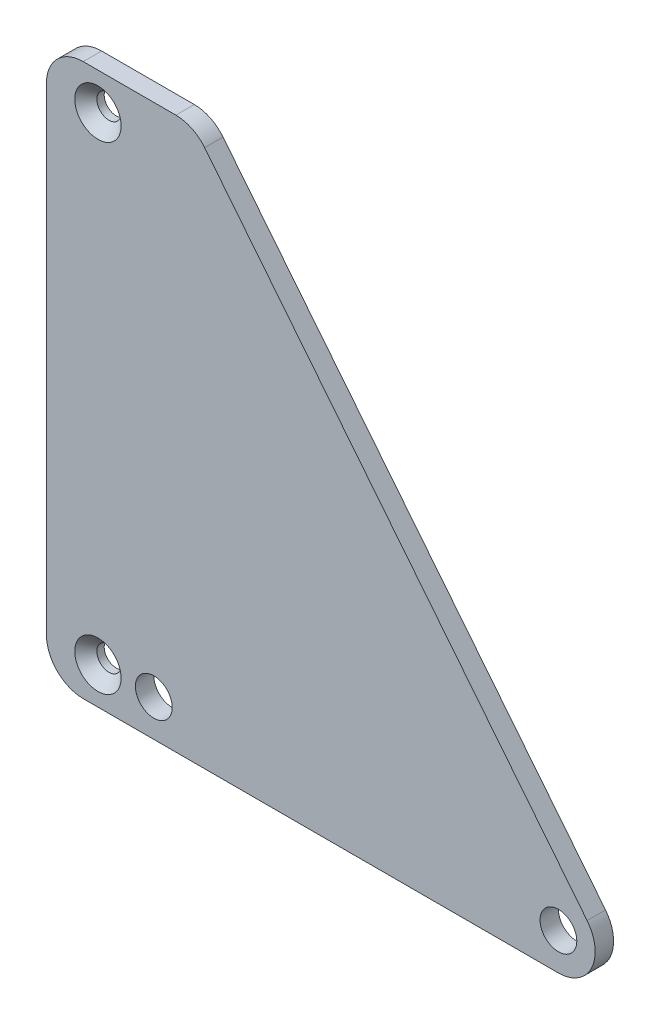
ISO-10303-21;
HEADER;
FILE_DESCRIPTION(('STEP AP214'),'2;1');
FILE_NAME('part.step','',(''),(''),'','','');
FILE_SCHEMA(('AUTOMOTIVE_DESIGN { 1 0 10303 214 1 1 1 1 }'));
ENDSEC;
DATA;
#1=APPLICATION_CONTEXT('core data for automotive mechanical design processes');
#2=APPLICATION_PROTOCOL_DEFINITION('international standard','automotive_design',2000,#1);
#3=PRODUCT_CONTEXT('',#1,'mechanical');
#4=PRODUCT('Part','Part','',(#3));
#5=PRODUCT_RELATED_PRODUCT_CATEGORY('part','',(#4));
#6=PRODUCT_DEFINITION_FORMATION('','',#4);
#7=PRODUCT_DEFINITION_CONTEXT('part definition',#1,'design');
#8=PRODUCT_DEFINITION('design','',#6,#7);
#9=PRODUCT_DEFINITION_SHAPE('','',#8);
#10=(LENGTH_UNIT() NAMED_UNIT(*) SI_UNIT(.MILLI.,.METRE.));
#11=(NAMED_UNIT(*) PLANE_ANGLE_UNIT() SI_UNIT($,.RADIAN.));
#12=(NAMED_UNIT(*) SI_UNIT($,.STERADIAN.) SOLID_ANGLE_UNIT());
#13=UNCERTAINTY_MEASURE_WITH_UNIT(LENGTH_MEASURE(1.E-05),#10,'distance_accuracy_value','');
#14=(GEOMETRIC_REPRESENTATION_CONTEXT(3) GLOBAL_UNCERTAINTY_ASSIGNED_CONTEXT((#13)) GLOBAL_UNIT_ASSIGNED_CONTEXT((#10,
#11,#12)) REPRESENTATION_CONTEXT('',''));
#15=CARTESIAN_POINT('',(0.,0.,0.));
#16=DIRECTION('',(0.,0.,1.));
#17=DIRECTION('',(1.,0.,0.));
#18=AXIS2_PLACEMENT_3D('',#15,#16,#17);
#19=CARTESIAN_POINT('',(0.,150.,2.5));
#20=DIRECTION('',(1.,0.,0.));
#21=DIRECTION('',(0.,1.,0.));
#22=AXIS2_PLACEMENT_3D('',#19,#20,#21);
#23=PLANE('',#22);
#24=DIRECTION('',(0.,-1.,0.));
#25=VECTOR('',#24,1.);
#26=CARTESIAN_POINT('',(0.,150.,2.5));
#27=LINE('',#26,#25);
#28=CARTESIAN_POINT('',(0.,140.,2.5));
#29=VERTEX_POINT('',#28);
#30=CARTESIAN_POINT('',(0.,10.,2.5));
#31=VERTEX_POINT('',#30);
#32=EDGE_CURVE('E132',#29,#31,#27,.T.);
#33=ORIENTED_EDGE('',*,*,#32,.F.);
#34=DIRECTION('',(0.,0.,-1.));
#35=VECTOR('',#34,1.);
#36=CARTESIAN_POINT('',(0.,140.,2.5));
#37=LINE('',#36,#35);
#38=CARTESIAN_POINT('',(0.,140.,-2.5));
#39=VERTEX_POINT('',#38);
#40=EDGE_CURVE('E11',#29,#39,#37,.T.);
#41=ORIENTED_EDGE('',*,*,#40,.T.);
#42=DIRECTION('',(0.,-1.,0.));
#43=VECTOR('',#42,1.);
#44=CARTESIAN_POINT('',(0.,150.,-2.5));
#45=LINE('',#44,#43);
#46=CARTESIAN_POINT('',(0.,10.,-2.5));
#47=VERTEX_POINT('',#46);
#48=EDGE_CURVE('E134',#39,#47,#45,.T.);
#49=ORIENTED_EDGE('',*,*,#48,.T.);
#50=DIRECTION('',(0.,0.,-1.));
#51=VECTOR('',#50,1.);
#52=CARTESIAN_POINT('',(0.,10.,2.5));
#53=LINE('',#52,#51);
#54=EDGE_CURVE('E45',#47,#31,#53,.F.);
#55=ORIENTED_EDGE('',*,*,#54,.T.);
#56=EDGE_LOOP('',(#33,#41,#49,#55));
#57=FACE_BOUND('',#56,.T.);
#58=ADVANCED_FACE('F37',(#57),#23,.F.);
#59=CARTESIAN_POINT('',(0.,0.,2.5));
#60=DIRECTION('',(0.,1.,0.));
#61=DIRECTION('',(-1.,0.,0.));
#62=AXIS2_PLACEMENT_3D('',#59,#60,#61);
#63=PLANE('',#62);
#64=DIRECTION('',(1.,0.,0.));
#65=VECTOR('',#64,1.);
#66=CARTESIAN_POINT('',(0.,0.,-2.5));
#67=LINE('',#66,#65);
#68=CARTESIAN_POINT('',(10.,0.,-2.5));
#69=VERTEX_POINT('',#68);
#70=CARTESIAN_POINT('',(139.193751525134,0.,-2.5));
#71=VERTEX_POINT('',#70);
#72=EDGE_CURVE('E130',#69,#71,#67,.T.);
#73=ORIENTED_EDGE('',*,*,#72,.T.);
#74=DIRECTION('',(0.,0.,-1.));
#75=VECTOR('',#74,1.);
#76=CARTESIAN_POINT('',(139.193751525134,0.,2.5));
#77=LINE('',#76,#75);
#78=CARTESIAN_POINT('',(139.193751525134,0.,2.5));
#79=VERTEX_POINT('',#78);
#80=EDGE_CURVE('E109',#71,#79,#77,.F.);
#81=ORIENTED_EDGE('',*,*,#80,.T.);
#82=DIRECTION('',(1.,0.,0.));
#83=VECTOR('',#82,1.);
#84=CARTESIAN_POINT('',(0.,0.,2.5));
#85=LINE('',#84,#83);
#86=CARTESIAN_POINT('',(10.,0.,2.5));
#87=VERTEX_POINT('',#86);
#88=EDGE_CURVE('E170',#87,#79,#85,.T.);
#89=ORIENTED_EDGE('',*,*,#88,.F.);
#90=DIRECTION('',(0.,0.,-1.));
#91=VECTOR('',#90,1.);
#92=CARTESIAN_POINT('',(10.,0.,2.5));
#93=LINE('',#92,#91);
#94=EDGE_CURVE('E114',#87,#69,#93,.T.);
#95=ORIENTED_EDGE('',*,*,#94,.T.);
#96=EDGE_LOOP('',(#73,#81,#89,#95));
#97=FACE_BOUND('',#96,.T.);
#98=ADVANCED_FACE('F174',(#97),#63,.F.);
#99=CARTESIAN_POINT('',(40.,150.,2.5));
#100=DIRECTION('',(-0.78086880944303,-0.624695047554424,0.));
#101=DIRECTION('',(0.624695047554424,-0.78086880944303,0.));
#102=AXIS2_PLACEMENT_3D('',#99,#100,#101);
#103=PLANE('',#102);
#104=DIRECTION('',(-0.624695047554424,0.78086880944303,0.));
#105=VECTOR('',#104,1.);
#106=CARTESIAN_POINT('',(40.,150.,2.5));
#107=LINE('',#106,#105);
#108=CARTESIAN_POINT('',(147.002439619565,16.2469504755443,2.5));
#109=VERTEX_POINT('',#108);
#110=CARTESIAN_POINT('',(43.0024396195646,146.246950475544,2.5));
#111=VERTEX_POINT('',#110);
#112=EDGE_CURVE('E123',#109,#111,#107,.T.);
#113=ORIENTED_EDGE('',*,*,#112,.F.);
#114=DIRECTION('',(0.,0.,-1.));
#115=VECTOR('',#114,1.);
#116=CARTESIAN_POINT('',(147.002439619565,16.2469504755443,2.5));
#117=LINE('',#116,#115);
#118=CARTESIAN_POINT('',(147.002439619565,16.2469504755443,-2.5));
#119=VERTEX_POINT('',#118);
#120=EDGE_CURVE('E108',#109,#119,#117,.T.);
#121=ORIENTED_EDGE('',*,*,#120,.T.);
#122=DIRECTION('',(-0.624695047554424,0.78086880944303,0.));
#123=VECTOR('',#122,1.);
#124=CARTESIAN_POINT('',(40.,150.,-2.5));
#125=LINE('',#124,#123);
#126=CARTESIAN_POINT('',(43.0024396195646,146.246950475544,-2.5));
#127=VERTEX_POINT('',#126);
#128=EDGE_CURVE('E121',#119,#127,#125,.T.);
#129=ORIENTED_EDGE('',*,*,#128,.T.);
#130=DIRECTION('',(0.,0.,-1.));
#131=VECTOR('',#130,1.);
#132=CARTESIAN_POINT('',(43.0024396195646,146.246950475544,2.5));
#133=LINE('',#132,#131);
#134=EDGE_CURVE('E125',#127,#111,#133,.F.);
#135=ORIENTED_EDGE('',*,*,#134,.T.);
#136=EDGE_LOOP('',(#113,#121,#129,#135));
#137=FACE_BOUND('',#136,.T.);
#138=ADVANCED_FACE('F120',(#137),#103,.F.);
#139=CARTESIAN_POINT('',(0.,150.,2.5));
#140=DIRECTION('',(0.,-1.,0.));
#141=DIRECTION('',(0.,0.,-1.));
#142=AXIS2_PLACEMENT_3D('',#139,#140,#141);
#143=PLANE('',#142);
#144=DIRECTION('',(-1.,0.,0.));
#145=VECTOR('',#144,1.);
#146=CARTESIAN_POINT('',(0.,150.,2.5));
#147=LINE('',#146,#145);
#148=CARTESIAN_POINT('',(35.1937515251343,150.,2.5));
#149=VERTEX_POINT('',#148);
#150=CARTESIAN_POINT('',(9.99999999999999,150.,2.5));
#151=VERTEX_POINT('',#150);
#152=EDGE_CURVE('E138',#149,#151,#147,.T.);
#153=ORIENTED_EDGE('',*,*,#152,.F.);
#154=DIRECTION('',(0.,0.,-1.));
#155=VECTOR('',#154,1.);
#156=CARTESIAN_POINT('',(35.1937515251343,150.,2.5));
#157=LINE('',#156,#155);
#158=CARTESIAN_POINT('',(35.1937515251343,150.,-2.5));
#159=VERTEX_POINT('',#158);
#160=EDGE_CURVE('E155',#149,#159,#157,.T.);
#161=ORIENTED_EDGE('',*,*,#160,.T.);
#162=DIRECTION('',(-1.,0.,0.));
#163=VECTOR('',#162,1.);
#164=CARTESIAN_POINT('',(0.,150.,-2.5));
#165=LINE('',#164,#163);
#166=CARTESIAN_POINT('',(9.99999999999999,150.,-2.5));
#167=VERTEX_POINT('',#166);
#168=EDGE_CURVE('E129',#159,#167,#165,.T.);
#169=ORIENTED_EDGE('',*,*,#168,.T.);
#170=DIRECTION('',(0.,0.,-1.));
#171=VECTOR('',#170,1.);
#172=CARTESIAN_POINT('',(9.99999999999999,150.,2.5));
#173=LINE('',#172,#171);
#174=EDGE_CURVE('E52',#167,#151,#173,.F.);
#175=ORIENTED_EDGE('',*,*,#174,.T.);
#176=EDGE_LOOP('',(#153,#161,#169,#175));
#177=FACE_BOUND('',#176,.T.);
#178=ADVANCED_FACE('F221',(#177),#143,.F.);
#179=CARTESIAN_POINT('',(0.,0.,2.5));
#180=DIRECTION('',(0.,0.,1.));
#181=DIRECTION('',(1.,0.,0.));
#182=AXIS2_PLACEMENT_3D('',#179,#180,#181);
#183=PLANE('',#182);
#184=CARTESIAN_POINT('',(29.1937515251343,10.0000000000001,2.5));
#185=DIRECTION('',(0.,0.,1.));
#186=DIRECTION('',(1.,0.,0.));
#187=AXIS2_PLACEMENT_3D('',#184,#185,#186);
#188=CIRCLE('',#187,5.);
#189=CARTESIAN_POINT('',(34.1937515251343,10.0000000000001,2.5));
#190=VERTEX_POINT('',#189);
#191=EDGE_CURVE('E204',#190,#190,#188,.T.);
#192=ORIENTED_EDGE('',*,*,#191,.F.);
#193=EDGE_LOOP('',(#192));
#194=FACE_BOUND('',#193,.T.);
#195=CARTESIAN_POINT('',(139.193751525134,10.0000000000001,2.5));
#196=DIRECTION('',(0.,0.,1.));
#197=DIRECTION('',(1.,0.,0.));
#198=AXIS2_PLACEMENT_3D('',#195,#196,#197);
#199=CIRCLE('',#198,5.00000000000002);
#200=CARTESIAN_POINT('',(144.193751525134,10.0000000000001,2.5));
#201=VERTEX_POINT('',#200);
#202=EDGE_CURVE('E198',#201,#201,#199,.T.);
#203=ORIENTED_EDGE('',*,*,#202,.F.);
#204=EDGE_LOOP('',(#203));
#205=FACE_BOUND('',#204,.T.);
#206=CARTESIAN_POINT('',(14.,140.,2.5));
#207=DIRECTION('',(0.,0.,1.));
#208=DIRECTION('',(1.,0.,0.));
#209=AXIS2_PLACEMENT_3D('',#206,#207,#208);
#210=CIRCLE('',#209,6.3);
#211=CARTESIAN_POINT('',(20.3,140.,2.5));
#212=VERTEX_POINT('',#211);
#213=EDGE_CURVE('E194',#212,#212,#210,.T.);
#214=ORIENTED_EDGE('',*,*,#213,.F.);
#215=EDGE_LOOP('',(#214));
#216=FACE_BOUND('',#215,.T.);
#217=CARTESIAN_POINT('',(14.,10.,2.5));
#218=DIRECTION('',(0.,0.,1.));
#219=DIRECTION('',(1.,0.,0.));
#220=AXIS2_PLACEMENT_3D('',#217,#218,#219);
#221=CIRCLE('',#220,6.3);
#222=CARTESIAN_POINT('',(20.3,10.,2.5));
#223=VERTEX_POINT('',#222);
#224=EDGE_CURVE('E185',#223,#223,#221,.T.);
#225=ORIENTED_EDGE('',*,*,#224,.F.);
#226=EDGE_LOOP('',(#225));
#227=FACE_BOUND('',#226,.T.);
#228=ORIENTED_EDGE('',*,*,#88,.T.);
#229=CARTESIAN_POINT('',(139.193751525134,10.0000000000001,2.5));
#230=DIRECTION('',(0.,0.,1.));
#231=DIRECTION('',(1.,0.,0.));
#232=AXIS2_PLACEMENT_3D('',#229,#230,#231);
#233=CIRCLE('',#232,10.);
#234=EDGE_CURVE('E152',#79,#109,#233,.T.);
#235=ORIENTED_EDGE('',*,*,#234,.T.);
#236=ORIENTED_EDGE('',*,*,#112,.T.);
#237=CARTESIAN_POINT('',(35.1937515251343,140.,2.5));
#238=DIRECTION('',(0.,0.,1.));
#239=DIRECTION('',(1.,0.,0.));
#240=AXIS2_PLACEMENT_3D('',#237,#238,#239);
#241=CIRCLE('',#240,10.);
#242=EDGE_CURVE('E59',#111,#149,#241,.T.);
#243=ORIENTED_EDGE('',*,*,#242,.T.);
#244=ORIENTED_EDGE('',*,*,#152,.T.);
#245=CARTESIAN_POINT('',(9.99999999999999,140.,2.5));
#246=DIRECTION('',(0.,0.,1.));
#247=DIRECTION('',(1.,0.,0.));
#248=AXIS2_PLACEMENT_3D('',#245,#246,#247);
#249=CIRCLE('',#248,10.);
#250=EDGE_CURVE('E149',#151,#29,#249,.T.);
#251=ORIENTED_EDGE('',*,*,#250,.T.);
#252=ORIENTED_EDGE('',*,*,#32,.T.);
#253=CARTESIAN_POINT('',(10.,10.,2.5));
#254=DIRECTION('',(0.,0.,1.));
#255=DIRECTION('',(1.,0.,0.));
#256=AXIS2_PLACEMENT_3D('',#253,#254,#255);
#257=CIRCLE('',#256,10.);
#258=EDGE_CURVE('E147',#31,#87,#257,.T.);
#259=ORIENTED_EDGE('',*,*,#258,.T.);
#260=EDGE_LOOP('',(#228,#235,#236,#243,#244,#251,#252,#259));
#261=FACE_BOUND('',#260,.T.);
#262=ADVANCED_FACE('F167',(#194,#205,#216,#227,#261),#183,.T.);
#263=CARTESIAN_POINT('',(0.,0.,-2.5));
#264=DIRECTION('',(0.,0.,1.));
#265=DIRECTION('',(1.,0.,0.));
#266=AXIS2_PLACEMENT_3D('',#263,#264,#265);
#267=PLANE('',#266);
#268=CARTESIAN_POINT('',(29.1937515251343,10.0000000000001,-2.5));
#269=DIRECTION('',(0.,0.,1.));
#270=DIRECTION('',(1.,0.,0.));
#271=AXIS2_PLACEMENT_3D('',#268,#269,#270);
#272=CIRCLE('',#271,5.);
#273=CARTESIAN_POINT('',(34.1937515251343,10.0000000000001,-2.5));
#274=VERTEX_POINT('',#273);
#275=EDGE_CURVE('E197',#274,#274,#272,.T.);
#276=ORIENTED_EDGE('',*,*,#275,.T.);
#277=EDGE_LOOP('',(#276));
#278=FACE_BOUND('',#277,.T.);
#279=CARTESIAN_POINT('',(139.193751525134,10.0000000000001,-2.5));
#280=DIRECTION('',(0.,0.,1.));
#281=DIRECTION('',(1.,0.,0.));
#282=AXIS2_PLACEMENT_3D('',#279,#280,#281);
#283=CIRCLE('',#282,5.00000000000002);
#284=CARTESIAN_POINT('',(144.193751525134,10.0000000000001,-2.5));
#285=VERTEX_POINT('',#284);
#286=EDGE_CURVE('E201',#285,#285,#283,.T.);
#287=ORIENTED_EDGE('',*,*,#286,.T.);
#288=EDGE_LOOP('',(#287));
#289=FACE_BOUND('',#288,.T.);
#290=CARTESIAN_POINT('',(14.,140.,-2.5));
#291=DIRECTION('',(0.,0.,1.));
#292=DIRECTION('',(1.,0.,0.));
#293=AXIS2_PLACEMENT_3D('',#290,#291,#292);
#294=CIRCLE('',#293,3.3);
#295=CARTESIAN_POINT('',(17.3,140.,-2.5));
#296=VERTEX_POINT('',#295);
#297=EDGE_CURVE('E188',#296,#296,#294,.T.);
#298=ORIENTED_EDGE('',*,*,#297,.T.);
#299=EDGE_LOOP('',(#298));
#300=FACE_BOUND('',#299,.T.);
#301=CARTESIAN_POINT('',(14.,10.,-2.5));
#302=DIRECTION('',(0.,0.,1.));
#303=DIRECTION('',(1.,0.,0.));
#304=AXIS2_PLACEMENT_3D('',#301,#302,#303);
#305=CIRCLE('',#304,3.3);
#306=CARTESIAN_POINT('',(17.3,10.,-2.5));
#307=VERTEX_POINT('',#306);
#308=EDGE_CURVE('E175',#307,#307,#305,.T.);
#309=ORIENTED_EDGE('',*,*,#308,.T.);
#310=EDGE_LOOP('',(#309));
#311=FACE_BOUND('',#310,.T.);
#312=ORIENTED_EDGE('',*,*,#128,.F.);
#313=CARTESIAN_POINT('',(139.193751525134,10.0000000000001,-2.5));
#314=DIRECTION('',(0.,0.,1.));
#315=DIRECTION('',(1.,0.,0.));
#316=AXIS2_PLACEMENT_3D('',#313,#314,#315);
#317=CIRCLE('',#316,10.);
#318=EDGE_CURVE('E104',#119,#71,#317,.F.);
#319=ORIENTED_EDGE('',*,*,#318,.T.);
#320=ORIENTED_EDGE('',*,*,#72,.F.);
#321=CARTESIAN_POINT('',(10.,10.,-2.5));
#322=DIRECTION('',(0.,0.,1.));
#323=DIRECTION('',(1.,0.,0.));
#324=AXIS2_PLACEMENT_3D('',#321,#322,#323);
#325=CIRCLE('',#324,10.);
#326=EDGE_CURVE('E124',#69,#47,#325,.F.);
#327=ORIENTED_EDGE('',*,*,#326,.T.);
#328=ORIENTED_EDGE('',*,*,#48,.F.);
#329=CARTESIAN_POINT('',(9.99999999999999,140.,-2.5));
#330=DIRECTION('',(0.,0.,1.));
#331=DIRECTION('',(1.,0.,0.));
#332=AXIS2_PLACEMENT_3D('',#329,#330,#331);
#333=CIRCLE('',#332,10.);
#334=EDGE_CURVE('E141',#39,#167,#333,.F.);
#335=ORIENTED_EDGE('',*,*,#334,.T.);
#336=ORIENTED_EDGE('',*,*,#168,.F.);
#337=CARTESIAN_POINT('',(35.1937515251343,140.,-2.5));
#338=DIRECTION('',(0.,0.,1.));
#339=DIRECTION('',(1.,0.,0.));
#340=AXIS2_PLACEMENT_3D('',#337,#338,#339);
#341=CIRCLE('',#340,10.);
#342=EDGE_CURVE('E115',#159,#127,#341,.F.);
#343=ORIENTED_EDGE('',*,*,#342,.T.);
#344=EDGE_LOOP('',(#312,#319,#320,#327,#328,#335,#336,#343));
#345=FACE_BOUND('',#344,.T.);
#346=ADVANCED_FACE('F127',(#278,#289,#300,#311,#345),#267,.F.);
#347=CARTESIAN_POINT('',(14.,10.,2.5));
#348=DIRECTION('',(0.,0.,1.));
#349=DIRECTION('',(1.,0.,0.));
#350=AXIS2_PLACEMENT_3D('',#347,#348,#349);
#351=CYLINDRICAL_SURFACE('',#350,3.3);
#352=ORIENTED_EDGE('',*,*,#308,.F.);
#353=EDGE_LOOP('',(#352));
#354=FACE_BOUND('',#353,.T.);
#355=CARTESIAN_POINT('',(14.,10.,-0.499999999999998));
#356=DIRECTION('',(0.,0.,1.));
#357=DIRECTION('',(1.,0.,0.));
#358=AXIS2_PLACEMENT_3D('',#355,#356,#357);
#359=CIRCLE('',#358,3.3);
#360=CARTESIAN_POINT('',(17.3,10.,-0.499999999999998));
#361=VERTEX_POINT('',#360);
#362=EDGE_CURVE('E177',#361,#361,#359,.T.);
#363=ORIENTED_EDGE('',*,*,#362,.T.);
#364=EDGE_LOOP('',(#363));
#365=FACE_BOUND('',#364,.T.);
#366=ADVANCED_FACE('F232',(#354,#365),#351,.F.);
#367=CARTESIAN_POINT('',(14.,10.,2.5));
#368=DIRECTION('',(0.,0.,1.));
#369=DIRECTION('',(1.,0.,0.));
#370=AXIS2_PLACEMENT_3D('',#367,#368,#369);
#371=CONICAL_SURFACE('',#370,6.3,0.785398163397449);
#372=ORIENTED_EDGE('',*,*,#362,.F.);
#373=EDGE_LOOP('',(#372));
#374=FACE_BOUND('',#373,.T.);
#375=ORIENTED_EDGE('',*,*,#224,.T.);
#376=EDGE_LOOP('',(#375));
#377=FACE_BOUND('',#376,.T.);
#378=ADVANCED_FACE('F229',(#374,#377),#371,.F.);
#379=CARTESIAN_POINT('',(14.,140.,2.5));
#380=DIRECTION('',(0.,0.,1.));
#381=DIRECTION('',(1.,0.,0.));
#382=AXIS2_PLACEMENT_3D('',#379,#380,#381);
#383=CYLINDRICAL_SURFACE('',#382,3.3);
#384=ORIENTED_EDGE('',*,*,#297,.F.);
#385=EDGE_LOOP('',(#384));
#386=FACE_BOUND('',#385,.T.);
#387=CARTESIAN_POINT('',(14.,140.,-0.499999999999998));
#388=DIRECTION('',(0.,0.,1.));
#389=DIRECTION('',(1.,0.,0.));
#390=AXIS2_PLACEMENT_3D('',#387,#388,#389);
#391=CIRCLE('',#390,3.3);
#392=CARTESIAN_POINT('',(17.3,140.,-0.499999999999998));
#393=VERTEX_POINT('',#392);
#394=EDGE_CURVE('E191',#393,#393,#391,.T.);
#395=ORIENTED_EDGE('',*,*,#394,.T.);
#396=EDGE_LOOP('',(#395));
#397=FACE_BOUND('',#396,.T.);
#398=ADVANCED_FACE('F231',(#386,#397),#383,.F.);
#399=CARTESIAN_POINT('',(14.,140.,2.5));
#400=DIRECTION('',(0.,0.,1.));
#401=DIRECTION('',(1.,0.,0.));
#402=AXIS2_PLACEMENT_3D('',#399,#400,#401);
#403=CONICAL_SURFACE('',#402,6.3,0.785398163397449);
#404=ORIENTED_EDGE('',*,*,#394,.F.);
#405=EDGE_LOOP('',(#404));
#406=FACE_BOUND('',#405,.T.);
#407=ORIENTED_EDGE('',*,*,#213,.T.);
#408=EDGE_LOOP('',(#407));
#409=FACE_BOUND('',#408,.T.);
#410=ADVANCED_FACE('F239',(#406,#409),#403,.F.);
#411=CARTESIAN_POINT('',(139.193751525134,10.0000000000001,2.5));
#412=DIRECTION('',(0.,0.,-1.));
#413=DIRECTION('',(-1.,0.,0.));
#414=AXIS2_PLACEMENT_3D('',#411,#412,#413);
#415=CYLINDRICAL_SURFACE('',#414,10.);
#416=ORIENTED_EDGE('',*,*,#234,.F.);
#417=ORIENTED_EDGE('',*,*,#80,.F.);
#418=ORIENTED_EDGE('',*,*,#318,.F.);
#419=ORIENTED_EDGE('',*,*,#120,.F.);
#420=EDGE_LOOP('',(#416,#417,#418,#419));
#421=FACE_BOUND('',#420,.T.);
#422=ADVANCED_FACE('F107',(#421),#415,.T.);
#423=CARTESIAN_POINT('',(35.1937515251343,140.,2.5));
#424=DIRECTION('',(0.,0.,-1.));
#425=DIRECTION('',(-1.,0.,0.));
#426=AXIS2_PLACEMENT_3D('',#423,#424,#425);
#427=CYLINDRICAL_SURFACE('',#426,10.);
#428=ORIENTED_EDGE('',*,*,#242,.F.);
#429=ORIENTED_EDGE('',*,*,#134,.F.);
#430=ORIENTED_EDGE('',*,*,#342,.F.);
#431=ORIENTED_EDGE('',*,*,#160,.F.);
#432=EDGE_LOOP('',(#428,#429,#430,#431));
#433=FACE_BOUND('',#432,.T.);
#434=ADVANCED_FACE('F255',(#433),#427,.T.);
#435=CARTESIAN_POINT('',(9.99999999999999,140.,2.5));
#436=DIRECTION('',(0.,0.,-1.));
#437=DIRECTION('',(-1.,0.,0.));
#438=AXIS2_PLACEMENT_3D('',#435,#436,#437);
#439=CYLINDRICAL_SURFACE('',#438,10.);
#440=ORIENTED_EDGE('',*,*,#250,.F.);
#441=ORIENTED_EDGE('',*,*,#174,.F.);
#442=ORIENTED_EDGE('',*,*,#334,.F.);
#443=ORIENTED_EDGE('',*,*,#40,.F.);
#444=EDGE_LOOP('',(#440,#441,#442,#443));
#445=FACE_BOUND('',#444,.T.);
#446=ADVANCED_FACE('F257',(#445),#439,.T.);
#447=CARTESIAN_POINT('',(10.,10.,2.5));
#448=DIRECTION('',(0.,0.,-1.));
#449=DIRECTION('',(-1.,0.,0.));
#450=AXIS2_PLACEMENT_3D('',#447,#448,#449);
#451=CYLINDRICAL_SURFACE('',#450,10.);
#452=ORIENTED_EDGE('',*,*,#258,.F.);
#453=ORIENTED_EDGE('',*,*,#54,.F.);
#454=ORIENTED_EDGE('',*,*,#326,.F.);
#455=ORIENTED_EDGE('',*,*,#94,.F.);
#456=EDGE_LOOP('',(#452,#453,#454,#455));
#457=FACE_BOUND('',#456,.T.);
#458=ADVANCED_FACE('F39',(#457),#451,.T.);
#459=CARTESIAN_POINT('',(139.193751525134,10.0000000000001,-2.5));
#460=DIRECTION('',(0.,0.,1.));
#461=DIRECTION('',(1.,0.,0.));
#462=AXIS2_PLACEMENT_3D('',#459,#460,#461);
#463=CYLINDRICAL_SURFACE('',#462,5.00000000000002);
#464=ORIENTED_EDGE('',*,*,#286,.F.);
#465=EDGE_LOOP('',(#464));
#466=FACE_BOUND('',#465,.T.);
#467=ORIENTED_EDGE('',*,*,#202,.T.);
#468=EDGE_LOOP('',(#467));
#469=FACE_BOUND('',#468,.T.);
#470=ADVANCED_FACE('F215',(#466,#469),#463,.F.);
#471=CARTESIAN_POINT('',(29.1937515251343,10.0000000000001,-2.5));
#472=DIRECTION('',(0.,0.,1.));
#473=DIRECTION('',(1.,0.,0.));
#474=AXIS2_PLACEMENT_3D('',#471,#472,#473);
#475=CYLINDRICAL_SURFACE('',#474,5.);
#476=ORIENTED_EDGE('',*,*,#275,.F.);
#477=EDGE_LOOP('',(#476));
#478=FACE_BOUND('',#477,.T.);
#479=ORIENTED_EDGE('',*,*,#191,.T.);
#480=EDGE_LOOP('',(#479));
#481=FACE_BOUND('',#480,.T.);
#482=ADVANCED_FACE('F212',(#478,#481),#475,.F.);
#483=CLOSED_SHELL('',(#58,#98,#138,#178,#262,#346,#366,#378,#398,#410,#422,#434,#446,#458,#470,#482));
#484=MANIFOLD_SOLID_BREP('B2',#483);
#485=ADVANCED_BREP_SHAPE_REPRESENTATION('',(#18,#484),#14);
#486=SHAPE_DEFINITION_REPRESENTATION(#9,#485);
ENDSEC;
END-ISO-10303-21;
